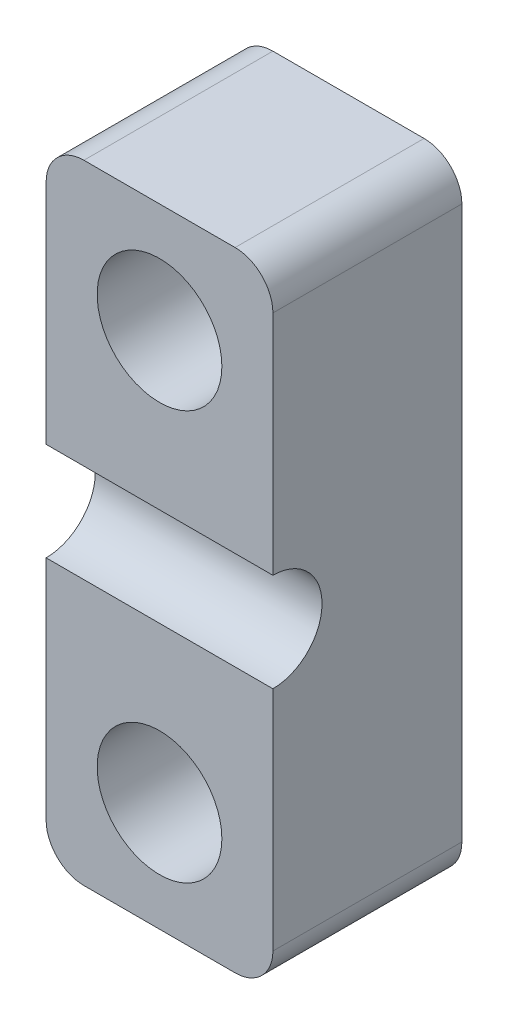
ISO-10303-21;
HEADER;
FILE_DESCRIPTION(('STEP AP214'),'2;1');
FILE_NAME('part.step','',(''),(''),'','','');
FILE_SCHEMA(('AUTOMOTIVE_DESIGN { 1 0 10303 214 1 1 1 1 }'));
ENDSEC;
DATA;
#1=APPLICATION_CONTEXT('core data for automotive mechanical design processes');
#2=APPLICATION_PROTOCOL_DEFINITION('international standard','automotive_design',2000,#1);
#3=PRODUCT_CONTEXT('',#1,'mechanical');
#4=PRODUCT('Part','Part','',(#3));
#5=PRODUCT_RELATED_PRODUCT_CATEGORY('part','',(#4));
#6=PRODUCT_DEFINITION_FORMATION('','',#4);
#7=PRODUCT_DEFINITION_CONTEXT('part definition',#1,'design');
#8=PRODUCT_DEFINITION('design','',#6,#7);
#9=PRODUCT_DEFINITION_SHAPE('','',#8);
#10=(LENGTH_UNIT() NAMED_UNIT(*) SI_UNIT(.MILLI.,.METRE.));
#11=(NAMED_UNIT(*) PLANE_ANGLE_UNIT() SI_UNIT($,.RADIAN.));
#12=(NAMED_UNIT(*) SI_UNIT($,.STERADIAN.) SOLID_ANGLE_UNIT());
#13=UNCERTAINTY_MEASURE_WITH_UNIT(LENGTH_MEASURE(1.E-05),#10,'distance_accuracy_value','');
#14=(GEOMETRIC_REPRESENTATION_CONTEXT(3) GLOBAL_UNCERTAINTY_ASSIGNED_CONTEXT((#13)) GLOBAL_UNIT_ASSIGNED_CONTEXT((#10,
#11,#12)) REPRESENTATION_CONTEXT('',''));
#15=CARTESIAN_POINT('',(0.,0.,0.));
#16=DIRECTION('',(0.,0.,1.));
#17=DIRECTION('',(1.,0.,0.));
#18=AXIS2_PLACEMENT_3D('',#15,#16,#17);
#19=CARTESIAN_POINT('',(-1.99999999999999,7.30999999999999,5.));
#20=DIRECTION('',(0.,0.,-1.));
#21=DIRECTION('',(-1.,0.,0.));
#22=AXIS2_PLACEMENT_3D('',#19,#20,#21);
#23=PLANE('',#22);
#24=CARTESIAN_POINT('',(0.,5.41000000000001,5.));
#25=DIRECTION('',(0.,0.,1.));
#26=DIRECTION('',(1.,0.,0.));
#27=AXIS2_PLACEMENT_3D('',#24,#25,#26);
#28=CIRCLE('',#27,1.65);
#29=CARTESIAN_POINT('',(1.65,5.41000000000001,5.));
#30=VERTEX_POINT('',#29);
#31=EDGE_CURVE('E237',#30,#30,#28,.T.);
#32=ORIENTED_EDGE('',*,*,#31,.F.);
#33=EDGE_LOOP('',(#32));
#34=FACE_BOUND('',#33,.T.);
#35=DIRECTION('',(0.,-1.,0.));
#36=VECTOR('',#35,1.);
#37=CARTESIAN_POINT('',(-3.,-7.31000000000001,5.));
#38=LINE('',#37,#36);
#39=CARTESIAN_POINT('',(-3.,7.30999999999998,5.));
#40=VERTEX_POINT('',#39);
#41=CARTESIAN_POINT('',(-3.,1.29999999999999,5.));
#42=VERTEX_POINT('',#41);
#43=EDGE_CURVE('E105',#40,#42,#38,.T.);
#44=ORIENTED_EDGE('',*,*,#43,.T.);
#45=DIRECTION('',(1.,0.,0.));
#46=VECTOR('',#45,1.);
#47=CARTESIAN_POINT('',(-5.90688837074972,1.29999999999999,5.));
#48=LINE('',#47,#46);
#49=CARTESIAN_POINT('',(3.,1.29999999999999,5.));
#50=VERTEX_POINT('',#49);
#51=EDGE_CURVE('E129',#42,#50,#48,.T.);
#52=ORIENTED_EDGE('',*,*,#51,.T.);
#53=DIRECTION('',(0.,1.,0.));
#54=VECTOR('',#53,1.);
#55=CARTESIAN_POINT('',(3.,-7.31000000000001,5.));
#56=LINE('',#55,#54);
#57=CARTESIAN_POINT('',(3.,7.30999999999999,5.));
#58=VERTEX_POINT('',#57);
#59=EDGE_CURVE('E122',#50,#58,#56,.T.);
#60=ORIENTED_EDGE('',*,*,#59,.T.);
#61=CARTESIAN_POINT('',(2.,7.30999999999999,5.));
#62=DIRECTION('',(0.,0.,1.));
#63=DIRECTION('',(-1.,0.,0.));
#64=AXIS2_PLACEMENT_3D('',#61,#62,#63);
#65=CIRCLE('',#64,1.);
#66=CARTESIAN_POINT('',(1.99999999999999,8.30999999999999,5.));
#67=VERTEX_POINT('',#66);
#68=EDGE_CURVE('E125',#58,#67,#65,.T.);
#69=ORIENTED_EDGE('',*,*,#68,.T.);
#70=DIRECTION('',(-1.,0.,0.));
#71=VECTOR('',#70,1.);
#72=CARTESIAN_POINT('',(-1.99999999999999,8.30999999999999,5.));
#73=LINE('',#72,#71);
#74=CARTESIAN_POINT('',(-1.99999999999999,8.30999999999999,5.));
#75=VERTEX_POINT('',#74);
#76=EDGE_CURVE('E64',#67,#75,#73,.T.);
#77=ORIENTED_EDGE('',*,*,#76,.T.);
#78=CARTESIAN_POINT('',(-1.99999999999999,7.30999999999999,5.));
#79=DIRECTION('',(0.,0.,1.));
#80=DIRECTION('',(-1.,0.,0.));
#81=AXIS2_PLACEMENT_3D('',#78,#79,#80);
#82=CIRCLE('',#81,1.);
#83=EDGE_CURVE('E181',#75,#40,#82,.T.);
#84=ORIENTED_EDGE('',*,*,#83,.T.);
#85=EDGE_LOOP('',(#44,#52,#60,#69,#77,#84));
#86=FACE_BOUND('',#85,.T.);
#87=ADVANCED_FACE('F39',(#34,#86),#23,.F.);
#88=CARTESIAN_POINT('',(3.,-7.31000000000001,5.));
#89=VERTEX_POINT('',#88);
#90=CARTESIAN_POINT('',(3.,-1.30000000000001,5.));
#91=VERTEX_POINT('',#90);
#92=EDGE_CURVE('E132',#89,#91,#56,.T.);
#93=ORIENTED_EDGE('',*,*,#92,.T.);
#94=DIRECTION('',(1.,0.,0.));
#95=VECTOR('',#94,1.);
#96=CARTESIAN_POINT('',(-5.90688837074972,-1.30000000000001,5.));
#97=LINE('',#96,#95);
#98=CARTESIAN_POINT('',(-3.,-1.30000000000001,5.));
#99=VERTEX_POINT('',#98);
#100=EDGE_CURVE('E55',#99,#91,#97,.T.);
#101=ORIENTED_EDGE('',*,*,#100,.F.);
#102=CARTESIAN_POINT('',(-3.,-7.31000000000001,5.));
#103=VERTEX_POINT('',#102);
#104=EDGE_CURVE('E230',#99,#103,#38,.T.);
#105=ORIENTED_EDGE('',*,*,#104,.T.);
#106=CARTESIAN_POINT('',(-1.99999999999999,-7.31000000000001,5.));
#107=DIRECTION('',(0.,0.,1.));
#108=DIRECTION('',(-1.,0.,0.));
#109=AXIS2_PLACEMENT_3D('',#106,#107,#108);
#110=CIRCLE('',#109,1.);
#111=CARTESIAN_POINT('',(-1.99999999999999,-8.31000000000001,5.));
#112=VERTEX_POINT('',#111);
#113=EDGE_CURVE('E203',#103,#112,#110,.T.);
#114=ORIENTED_EDGE('',*,*,#113,.T.);
#115=DIRECTION('',(1.,0.,0.));
#116=VECTOR('',#115,1.);
#117=CARTESIAN_POINT('',(-1.99999999999999,-8.31000000000001,5.));
#118=LINE('',#117,#116);
#119=CARTESIAN_POINT('',(1.99999999999999,-8.31000000000001,5.));
#120=VERTEX_POINT('',#119);
#121=EDGE_CURVE('E222',#112,#120,#118,.T.);
#122=ORIENTED_EDGE('',*,*,#121,.T.);
#123=CARTESIAN_POINT('',(2.,-7.31000000000001,5.));
#124=DIRECTION('',(0.,0.,1.));
#125=DIRECTION('',(1.,0.,0.));
#126=AXIS2_PLACEMENT_3D('',#123,#124,#125);
#127=CIRCLE('',#126,1.);
#128=EDGE_CURVE('E133',#120,#89,#127,.T.);
#129=ORIENTED_EDGE('',*,*,#128,.T.);
#130=EDGE_LOOP('',(#93,#101,#105,#114,#122,#129));
#131=FACE_BOUND('',#130,.T.);
#132=CARTESIAN_POINT('',(0.,-5.41000000000001,5.));
#133=DIRECTION('',(0.,0.,1.));
#134=DIRECTION('',(1.,0.,0.));
#135=AXIS2_PLACEMENT_3D('',#132,#133,#134);
#136=CIRCLE('',#135,1.65);
#137=CARTESIAN_POINT('',(1.65,-5.41000000000001,5.));
#138=VERTEX_POINT('',#137);
#139=EDGE_CURVE('E162',#138,#138,#136,.T.);
#140=ORIENTED_EDGE('',*,*,#139,.F.);
#141=EDGE_LOOP('',(#140));
#142=FACE_BOUND('',#141,.T.);
#143=ADVANCED_FACE('F259',(#131,#142),#23,.F.);
#144=CARTESIAN_POINT('',(-1.99999999999999,7.30999999999999,0.));
#145=DIRECTION('',(0.,0.,-1.));
#146=DIRECTION('',(-1.,0.,0.));
#147=AXIS2_PLACEMENT_3D('',#144,#145,#146);
#148=PLANE('',#147);
#149=CARTESIAN_POINT('',(0.,-5.41000000000001,0.));
#150=DIRECTION('',(0.,0.,1.));
#151=DIRECTION('',(1.,0.,0.));
#152=AXIS2_PLACEMENT_3D('',#149,#150,#151);
#153=CIRCLE('',#152,1.65);
#154=CARTESIAN_POINT('',(1.65,-5.41000000000001,0.));
#155=VERTEX_POINT('',#154);
#156=EDGE_CURVE('E233',#155,#155,#153,.T.);
#157=ORIENTED_EDGE('',*,*,#156,.T.);
#158=EDGE_LOOP('',(#157));
#159=FACE_BOUND('',#158,.T.);
#160=CARTESIAN_POINT('',(-1.99999999999999,7.30999999999999,0.));
#161=DIRECTION('',(0.,0.,1.));
#162=DIRECTION('',(-1.,0.,0.));
#163=AXIS2_PLACEMENT_3D('',#160,#161,#162);
#164=CIRCLE('',#163,1.);
#165=CARTESIAN_POINT('',(-1.99999999999999,8.30999999999999,0.));
#166=VERTEX_POINT('',#165);
#167=CARTESIAN_POINT('',(-3.,7.30999999999998,0.));
#168=VERTEX_POINT('',#167);
#169=EDGE_CURVE('E157',#166,#168,#164,.T.);
#170=ORIENTED_EDGE('',*,*,#169,.F.);
#171=DIRECTION('',(-1.,0.,0.));
#172=VECTOR('',#171,1.);
#173=CARTESIAN_POINT('',(-1.99999999999999,8.30999999999999,0.));
#174=LINE('',#173,#172);
#175=CARTESIAN_POINT('',(1.99999999999999,8.30999999999999,0.));
#176=VERTEX_POINT('',#175);
#177=EDGE_CURVE('E97',#176,#166,#174,.T.);
#178=ORIENTED_EDGE('',*,*,#177,.F.);
#179=CARTESIAN_POINT('',(2.,7.30999999999999,0.));
#180=DIRECTION('',(0.,0.,1.));
#181=DIRECTION('',(-1.,0.,0.));
#182=AXIS2_PLACEMENT_3D('',#179,#180,#181);
#183=CIRCLE('',#182,1.);
#184=CARTESIAN_POINT('',(3.,7.30999999999999,0.));
#185=VERTEX_POINT('',#184);
#186=EDGE_CURVE('E176',#185,#176,#183,.T.);
#187=ORIENTED_EDGE('',*,*,#186,.F.);
#188=DIRECTION('',(0.,1.,0.));
#189=VECTOR('',#188,1.);
#190=CARTESIAN_POINT('',(3.,-7.31000000000001,0.));
#191=LINE('',#190,#189);
#192=CARTESIAN_POINT('',(3.,-7.31000000000001,0.));
#193=VERTEX_POINT('',#192);
#194=EDGE_CURVE('E140',#193,#185,#191,.T.);
#195=ORIENTED_EDGE('',*,*,#194,.F.);
#196=CARTESIAN_POINT('',(2.,-7.31000000000001,0.));
#197=DIRECTION('',(0.,0.,1.));
#198=DIRECTION('',(1.,0.,0.));
#199=AXIS2_PLACEMENT_3D('',#196,#197,#198);
#200=CIRCLE('',#199,1.);
#201=CARTESIAN_POINT('',(1.99999999999999,-8.31000000000001,0.));
#202=VERTEX_POINT('',#201);
#203=EDGE_CURVE('E171',#202,#193,#200,.T.);
#204=ORIENTED_EDGE('',*,*,#203,.F.);
#205=DIRECTION('',(1.,0.,0.));
#206=VECTOR('',#205,1.);
#207=CARTESIAN_POINT('',(-1.99999999999999,-8.31000000000001,0.));
#208=LINE('',#207,#206);
#209=CARTESIAN_POINT('',(-1.99999999999999,-8.31000000000001,0.));
#210=VERTEX_POINT('',#209);
#211=EDGE_CURVE('E168',#210,#202,#208,.T.);
#212=ORIENTED_EDGE('',*,*,#211,.F.);
#213=CARTESIAN_POINT('',(-1.99999999999999,-7.31000000000001,0.));
#214=DIRECTION('',(0.,0.,1.));
#215=DIRECTION('',(-1.,0.,0.));
#216=AXIS2_PLACEMENT_3D('',#213,#214,#215);
#217=CIRCLE('',#216,1.);
#218=CARTESIAN_POINT('',(-3.,-7.31000000000001,0.));
#219=VERTEX_POINT('',#218);
#220=EDGE_CURVE('E165',#219,#210,#217,.T.);
#221=ORIENTED_EDGE('',*,*,#220,.F.);
#222=DIRECTION('',(0.,-1.,0.));
#223=VECTOR('',#222,1.);
#224=CARTESIAN_POINT('',(-3.,-7.31000000000001,0.));
#225=LINE('',#224,#223);
#226=EDGE_CURVE('E161',#168,#219,#225,.T.);
#227=ORIENTED_EDGE('',*,*,#226,.F.);
#228=EDGE_LOOP('',(#170,#178,#187,#195,#204,#212,#221,#227));
#229=FACE_BOUND('',#228,.T.);
#230=CARTESIAN_POINT('',(0.,5.41000000000001,0.));
#231=DIRECTION('',(0.,0.,1.));
#232=DIRECTION('',(1.,0.,0.));
#233=AXIS2_PLACEMENT_3D('',#230,#231,#232);
#234=CIRCLE('',#233,1.65);
#235=CARTESIAN_POINT('',(1.65,5.41000000000001,0.));
#236=VERTEX_POINT('',#235);
#237=EDGE_CURVE('E241',#236,#236,#234,.T.);
#238=ORIENTED_EDGE('',*,*,#237,.T.);
#239=EDGE_LOOP('',(#238));
#240=FACE_BOUND('',#239,.T.);
#241=ADVANCED_FACE('F208',(#159,#229,#240),#148,.T.);
#242=CARTESIAN_POINT('',(-1.99999999999999,7.30999999999999,5.));
#243=DIRECTION('',(0.,0.,-1.));
#244=DIRECTION('',(-1.,0.,0.));
#245=AXIS2_PLACEMENT_3D('',#242,#243,#244);
#246=CYLINDRICAL_SURFACE('',#245,1.);
#247=ORIENTED_EDGE('',*,*,#169,.T.);
#248=DIRECTION('',(0.,0.,-1.));
#249=VECTOR('',#248,1.);
#250=CARTESIAN_POINT('',(-3.,7.30999999999998,5.));
#251=LINE('',#250,#249);
#252=EDGE_CURVE('E11',#40,#168,#251,.T.);
#253=ORIENTED_EDGE('',*,*,#252,.F.);
#254=ORIENTED_EDGE('',*,*,#83,.F.);
#255=DIRECTION('',(0.,0.,-1.));
#256=VECTOR('',#255,1.);
#257=CARTESIAN_POINT('',(-1.99999999999999,8.30999999999999,5.));
#258=LINE('',#257,#256);
#259=EDGE_CURVE('E152',#75,#166,#258,.T.);
#260=ORIENTED_EDGE('',*,*,#259,.T.);
#261=EDGE_LOOP('',(#247,#253,#254,#260));
#262=FACE_BOUND('',#261,.T.);
#263=ADVANCED_FACE('F41',(#262),#246,.T.);
#264=CARTESIAN_POINT('',(-3.,-7.31000000000001,5.));
#265=DIRECTION('',(1.,0.,0.));
#266=DIRECTION('',(0.,0.,-1.));
#267=AXIS2_PLACEMENT_3D('',#264,#265,#266);
#268=PLANE('',#267);
#269=ORIENTED_EDGE('',*,*,#104,.F.);
#270=CARTESIAN_POINT('',(-3.,0.,5.));
#271=DIRECTION('',(1.,0.,0.));
#272=DIRECTION('',(0.,0.,-1.));
#273=AXIS2_PLACEMENT_3D('',#270,#271,#272);
#274=CIRCLE('',#273,1.3);
#275=EDGE_CURVE('E245',#42,#99,#274,.F.);
#276=ORIENTED_EDGE('',*,*,#275,.F.);
#277=ORIENTED_EDGE('',*,*,#43,.F.);
#278=ORIENTED_EDGE('',*,*,#252,.T.);
#279=ORIENTED_EDGE('',*,*,#226,.T.);
#280=DIRECTION('',(0.,0.,-1.));
#281=VECTOR('',#280,1.);
#282=CARTESIAN_POINT('',(-3.,-7.31000000000001,5.));
#283=LINE('',#282,#281);
#284=EDGE_CURVE('E48',#103,#219,#283,.T.);
#285=ORIENTED_EDGE('',*,*,#284,.F.);
#286=EDGE_LOOP('',(#269,#276,#277,#278,#279,#285));
#287=FACE_BOUND('',#286,.T.);
#288=ADVANCED_FACE('F261',(#287),#268,.F.);
#289=CARTESIAN_POINT('',(-1.99999999999999,-7.31000000000001,5.));
#290=DIRECTION('',(0.,0.,-1.));
#291=DIRECTION('',(-1.,0.,0.));
#292=AXIS2_PLACEMENT_3D('',#289,#290,#291);
#293=CYLINDRICAL_SURFACE('',#292,1.);
#294=ORIENTED_EDGE('',*,*,#220,.T.);
#295=DIRECTION('',(0.,0.,-1.));
#296=VECTOR('',#295,1.);
#297=CARTESIAN_POINT('',(-1.99999999999999,-8.31000000000001,5.));
#298=LINE('',#297,#296);
#299=EDGE_CURVE('E192',#112,#210,#298,.T.);
#300=ORIENTED_EDGE('',*,*,#299,.F.);
#301=ORIENTED_EDGE('',*,*,#113,.F.);
#302=ORIENTED_EDGE('',*,*,#284,.T.);
#303=EDGE_LOOP('',(#294,#300,#301,#302));
#304=FACE_BOUND('',#303,.T.);
#305=ADVANCED_FACE('F201',(#304),#293,.T.);
#306=CARTESIAN_POINT('',(-1.99999999999999,-8.31000000000001,5.));
#307=DIRECTION('',(0.,1.,0.));
#308=DIRECTION('',(0.,0.,1.));
#309=AXIS2_PLACEMENT_3D('',#306,#307,#308);
#310=PLANE('',#309);
#311=ORIENTED_EDGE('',*,*,#211,.T.);
#312=DIRECTION('',(0.,0.,-1.));
#313=VECTOR('',#312,1.);
#314=CARTESIAN_POINT('',(1.99999999999999,-8.31000000000001,5.));
#315=LINE('',#314,#313);
#316=EDGE_CURVE('E188',#120,#202,#315,.T.);
#317=ORIENTED_EDGE('',*,*,#316,.F.);
#318=ORIENTED_EDGE('',*,*,#121,.F.);
#319=ORIENTED_EDGE('',*,*,#299,.T.);
#320=EDGE_LOOP('',(#311,#317,#318,#319));
#321=FACE_BOUND('',#320,.T.);
#322=ADVANCED_FACE('F213',(#321),#310,.F.);
#323=CARTESIAN_POINT('',(2.,-7.31000000000001,5.));
#324=DIRECTION('',(0.,0.,-1.));
#325=DIRECTION('',(-1.,0.,0.));
#326=AXIS2_PLACEMENT_3D('',#323,#324,#325);
#327=CYLINDRICAL_SURFACE('',#326,1.);
#328=ORIENTED_EDGE('',*,*,#203,.T.);
#329=DIRECTION('',(0.,0.,-1.));
#330=VECTOR('',#329,1.);
#331=CARTESIAN_POINT('',(3.,-7.31000000000001,5.));
#332=LINE('',#331,#330);
#333=EDGE_CURVE('E144',#89,#193,#332,.T.);
#334=ORIENTED_EDGE('',*,*,#333,.F.);
#335=ORIENTED_EDGE('',*,*,#128,.F.);
#336=ORIENTED_EDGE('',*,*,#316,.T.);
#337=EDGE_LOOP('',(#328,#334,#335,#336));
#338=FACE_BOUND('',#337,.T.);
#339=ADVANCED_FACE('F217',(#338),#327,.T.);
#340=CARTESIAN_POINT('',(3.,-7.31000000000001,5.));
#341=DIRECTION('',(-1.,0.,0.));
#342=DIRECTION('',(0.,0.,1.));
#343=AXIS2_PLACEMENT_3D('',#340,#341,#342);
#344=PLANE('',#343);
#345=ORIENTED_EDGE('',*,*,#59,.F.);
#346=CARTESIAN_POINT('',(3.,0.,5.));
#347=DIRECTION('',(1.,0.,0.));
#348=DIRECTION('',(0.,0.,-1.));
#349=AXIS2_PLACEMENT_3D('',#346,#347,#348);
#350=CIRCLE('',#349,1.3);
#351=EDGE_CURVE('E251',#91,#50,#350,.T.);
#352=ORIENTED_EDGE('',*,*,#351,.F.);
#353=ORIENTED_EDGE('',*,*,#92,.F.);
#354=ORIENTED_EDGE('',*,*,#333,.T.);
#355=ORIENTED_EDGE('',*,*,#194,.T.);
#356=DIRECTION('',(0.,0.,-1.));
#357=VECTOR('',#356,1.);
#358=CARTESIAN_POINT('',(3.,7.30999999999999,5.));
#359=LINE('',#358,#357);
#360=EDGE_CURVE('E136',#58,#185,#359,.T.);
#361=ORIENTED_EDGE('',*,*,#360,.F.);
#362=EDGE_LOOP('',(#345,#352,#353,#354,#355,#361));
#363=FACE_BOUND('',#362,.T.);
#364=ADVANCED_FACE('F137',(#363),#344,.F.);
#365=CARTESIAN_POINT('',(2.,7.30999999999999,5.));
#366=DIRECTION('',(0.,0.,-1.));
#367=DIRECTION('',(-1.,0.,0.));
#368=AXIS2_PLACEMENT_3D('',#365,#366,#367);
#369=CYLINDRICAL_SURFACE('',#368,1.);
#370=ORIENTED_EDGE('',*,*,#186,.T.);
#371=DIRECTION('',(0.,0.,-1.));
#372=VECTOR('',#371,1.);
#373=CARTESIAN_POINT('',(1.99999999999999,8.30999999999999,5.));
#374=LINE('',#373,#372);
#375=EDGE_CURVE('E145',#67,#176,#374,.T.);
#376=ORIENTED_EDGE('',*,*,#375,.F.);
#377=ORIENTED_EDGE('',*,*,#68,.F.);
#378=ORIENTED_EDGE('',*,*,#360,.T.);
#379=EDGE_LOOP('',(#370,#376,#377,#378));
#380=FACE_BOUND('',#379,.T.);
#381=ADVANCED_FACE('F147',(#380),#369,.T.);
#382=CARTESIAN_POINT('',(-1.99999999999999,8.30999999999999,5.));
#383=DIRECTION('',(0.,-1.,0.));
#384=DIRECTION('',(0.,0.,-1.));
#385=AXIS2_PLACEMENT_3D('',#382,#383,#384);
#386=PLANE('',#385);
#387=ORIENTED_EDGE('',*,*,#177,.T.);
#388=ORIENTED_EDGE('',*,*,#259,.F.);
#389=ORIENTED_EDGE('',*,*,#76,.F.);
#390=ORIENTED_EDGE('',*,*,#375,.T.);
#391=EDGE_LOOP('',(#387,#388,#389,#390));
#392=FACE_BOUND('',#391,.T.);
#393=ADVANCED_FACE('F284',(#392),#386,.F.);
#394=CARTESIAN_POINT('',(0.,-5.41000000000001,5.));
#395=DIRECTION('',(0.,0.,-1.));
#396=DIRECTION('',(-1.,0.,0.));
#397=AXIS2_PLACEMENT_3D('',#394,#395,#396);
#398=CYLINDRICAL_SURFACE('',#397,1.65);
#399=ORIENTED_EDGE('',*,*,#139,.T.);
#400=EDGE_LOOP('',(#399));
#401=FACE_BOUND('',#400,.T.);
#402=ORIENTED_EDGE('',*,*,#156,.F.);
#403=EDGE_LOOP('',(#402));
#404=FACE_BOUND('',#403,.T.);
#405=ADVANCED_FACE('F279',(#401,#404),#398,.F.);
#406=CARTESIAN_POINT('',(0.,5.41000000000001,5.));
#407=DIRECTION('',(0.,0.,-1.));
#408=DIRECTION('',(-1.,0.,0.));
#409=AXIS2_PLACEMENT_3D('',#406,#407,#408);
#410=CYLINDRICAL_SURFACE('',#409,1.65);
#411=ORIENTED_EDGE('',*,*,#31,.T.);
#412=EDGE_LOOP('',(#411));
#413=FACE_BOUND('',#412,.T.);
#414=ORIENTED_EDGE('',*,*,#237,.F.);
#415=EDGE_LOOP('',(#414));
#416=FACE_BOUND('',#415,.T.);
#417=ADVANCED_FACE('F321',(#413,#416),#410,.F.);
#418=CARTESIAN_POINT('',(-5.90688837074972,0.,5.));
#419=DIRECTION('',(1.,0.,0.));
#420=DIRECTION('',(0.,0.,-1.));
#421=AXIS2_PLACEMENT_3D('',#418,#419,#420);
#422=CYLINDRICAL_SURFACE('',#421,1.3);
#423=ORIENTED_EDGE('',*,*,#275,.T.);
#424=ORIENTED_EDGE('',*,*,#100,.T.);
#425=ORIENTED_EDGE('',*,*,#351,.T.);
#426=ORIENTED_EDGE('',*,*,#51,.F.);
#427=EDGE_LOOP('',(#423,#424,#425,#426));
#428=FACE_BOUND('',#427,.T.);
#429=ADVANCED_FACE('F258',(#428),#422,.F.);
#430=CLOSED_SHELL('',(#87,#143,#241,#263,#288,#305,#322,#339,#364,#381,#393,#405,#417,#429));
#431=MANIFOLD_SOLID_BREP('B2',#430);
#432=ADVANCED_BREP_SHAPE_REPRESENTATION('',(#18,#431),#14);
#433=SHAPE_DEFINITION_REPRESENTATION(#9,#432);
ENDSEC;
END-ISO-10303-21;
